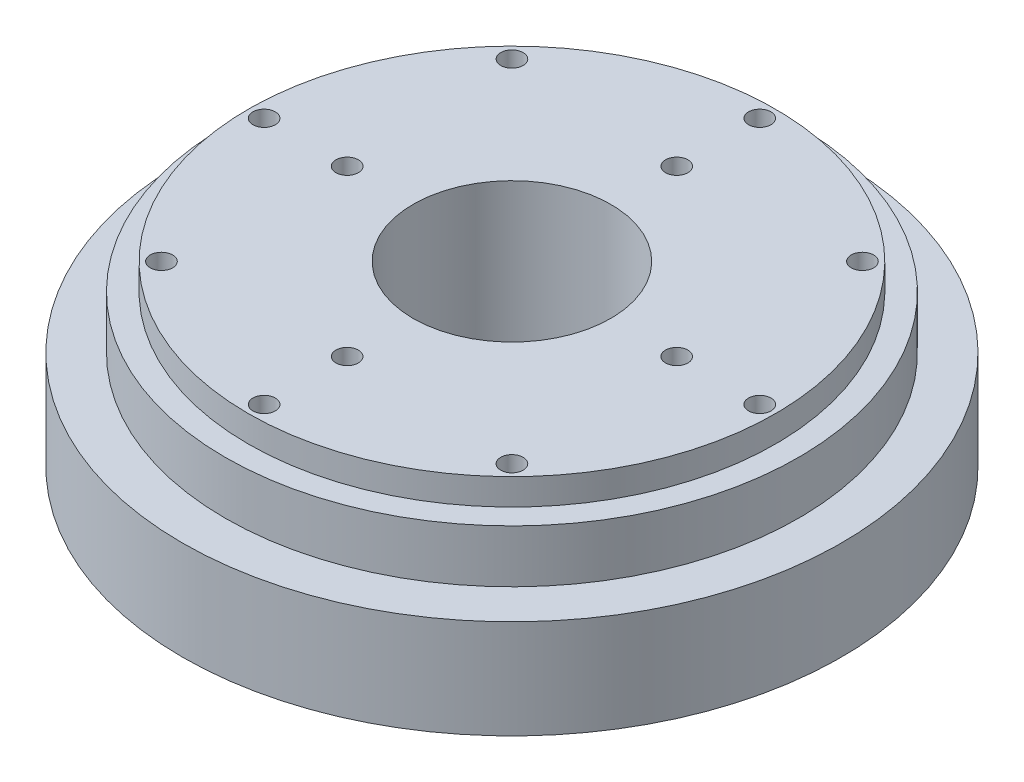
ISO-10303-21;
HEADER;
FILE_DESCRIPTION(('STEP AP214'),'2;1');
FILE_NAME('part.step','',(''),(''),'','','');
FILE_SCHEMA(('AUTOMOTIVE_DESIGN { 1 0 10303 214 1 1 1 1 }'));
ENDSEC;
DATA;
#1=APPLICATION_CONTEXT('core data for automotive mechanical design processes');
#2=APPLICATION_PROTOCOL_DEFINITION('international standard','automotive_design',2000,#1);
#3=PRODUCT_CONTEXT('',#1,'mechanical');
#4=PRODUCT('Part','Part','',(#3));
#5=PRODUCT_RELATED_PRODUCT_CATEGORY('part','',(#4));
#6=PRODUCT_DEFINITION_FORMATION('','',#4);
#7=PRODUCT_DEFINITION_CONTEXT('part definition',#1,'design');
#8=PRODUCT_DEFINITION('design','',#6,#7);
#9=PRODUCT_DEFINITION_SHAPE('','',#8);
#10=(LENGTH_UNIT() NAMED_UNIT(*) SI_UNIT(.MILLI.,.METRE.));
#11=(NAMED_UNIT(*) PLANE_ANGLE_UNIT() SI_UNIT($,.RADIAN.));
#12=(NAMED_UNIT(*) SI_UNIT($,.STERADIAN.) SOLID_ANGLE_UNIT());
#13=UNCERTAINTY_MEASURE_WITH_UNIT(LENGTH_MEASURE(1.E-05),#10,'distance_accuracy_value','');
#14=(GEOMETRIC_REPRESENTATION_CONTEXT(3) GLOBAL_UNCERTAINTY_ASSIGNED_CONTEXT((#13)) GLOBAL_UNIT_ASSIGNED_CONTEXT((#10,
#11,#12)) REPRESENTATION_CONTEXT('',''));
#15=CARTESIAN_POINT('',(0.,0.,0.));
#16=DIRECTION('',(0.,0.,1.));
#17=DIRECTION('',(1.,0.,0.));
#18=AXIS2_PLACEMENT_3D('',#15,#16,#17);
#19=CARTESIAN_POINT('',(0.,15.,0.));
#20=DIRECTION('',(0.,1.,0.));
#21=DIRECTION('',(0.,0.,1.));
#22=AXIS2_PLACEMENT_3D('',#19,#20,#21);
#23=PLANE('',#22);
#24=CARTESIAN_POINT('',(0.,15.,0.));
#25=DIRECTION('',(0.,1.,0.));
#26=DIRECTION('',(0.,0.,1.));
#27=AXIS2_PLACEMENT_3D('',#24,#25,#26);
#28=CIRCLE('',#27,43.5);
#29=CARTESIAN_POINT('',(0.,15.,43.5));
#30=VERTEX_POINT('',#29);
#31=EDGE_CURVE('E42',#30,#30,#28,.T.);
#32=ORIENTED_EDGE('',*,*,#31,.F.);
#33=EDGE_LOOP('',(#32));
#34=FACE_BOUND('',#33,.T.);
#35=CARTESIAN_POINT('',(0.,15.,0.));
#36=DIRECTION('',(0.,1.,0.));
#37=DIRECTION('',(0.,0.,1.));
#38=AXIS2_PLACEMENT_3D('',#35,#36,#37);
#39=CIRCLE('',#38,50.);
#40=CARTESIAN_POINT('',(0.,15.,50.));
#41=VERTEX_POINT('',#40);
#42=EDGE_CURVE('E173',#41,#41,#39,.T.);
#43=ORIENTED_EDGE('',*,*,#42,.T.);
#44=EDGE_LOOP('',(#43));
#45=FACE_BOUND('',#44,.T.);
#46=ADVANCED_FACE('F33',(#34,#45),#23,.T.);
#47=CARTESIAN_POINT('',(0.,0.,0.));
#48=DIRECTION('',(0.,1.,0.));
#49=DIRECTION('',(0.,0.,1.));
#50=AXIS2_PLACEMENT_3D('',#47,#48,#49);
#51=PLANE('',#50);
#52=CARTESIAN_POINT('',(0.,0.,0.));
#53=DIRECTION('',(0.,1.,0.));
#54=DIRECTION('',(0.,0.,1.));
#55=AXIS2_PLACEMENT_3D('',#52,#53,#54);
#56=CIRCLE('',#55,50.);
#57=CARTESIAN_POINT('',(0.,0.,50.));
#58=VERTEX_POINT('',#57);
#59=EDGE_CURVE('E37',#58,#58,#56,.T.);
#60=ORIENTED_EDGE('',*,*,#59,.F.);
#61=EDGE_LOOP('',(#60));
#62=FACE_BOUND('',#61,.T.);
#63=CARTESIAN_POINT('',(0.,0.,0.));
#64=DIRECTION('',(0.,1.,0.));
#65=DIRECTION('',(0.,0.,1.));
#66=AXIS2_PLACEMENT_3D('',#63,#64,#65);
#67=CIRCLE('',#66,15.);
#68=CARTESIAN_POINT('',(0.,0.,15.));
#69=VERTEX_POINT('',#68);
#70=EDGE_CURVE('E170',#69,#69,#67,.T.);
#71=ORIENTED_EDGE('',*,*,#70,.T.);
#72=EDGE_LOOP('',(#71));
#73=FACE_BOUND('',#72,.T.);
#74=ADVANCED_FACE('F182',(#62,#73),#51,.F.);
#75=CARTESIAN_POINT('',(0.,15.,0.));
#76=DIRECTION('',(0.,-1.,0.));
#77=DIRECTION('',(0.,0.,-1.));
#78=AXIS2_PLACEMENT_3D('',#75,#76,#77);
#79=CYLINDRICAL_SURFACE('',#78,50.);
#80=ORIENTED_EDGE('',*,*,#42,.F.);
#81=EDGE_LOOP('',(#80));
#82=FACE_BOUND('',#81,.T.);
#83=ORIENTED_EDGE('',*,*,#59,.T.);
#84=EDGE_LOOP('',(#83));
#85=FACE_BOUND('',#84,.T.);
#86=ADVANCED_FACE('F35',(#82,#85),#79,.T.);
#87=CARTESIAN_POINT('',(0.,15.,0.));
#88=DIRECTION('',(0.,-1.,0.));
#89=DIRECTION('',(0.,0.,-1.));
#90=AXIS2_PLACEMENT_3D('',#87,#88,#89);
#91=CYLINDRICAL_SURFACE('',#90,15.);
#92=ORIENTED_EDGE('',*,*,#70,.F.);
#93=EDGE_LOOP('',(#92));
#94=FACE_BOUND('',#93,.T.);
#95=CARTESIAN_POINT('',(0.,27.,0.));
#96=DIRECTION('',(0.,1.,0.));
#97=DIRECTION('',(0.,0.,1.));
#98=AXIS2_PLACEMENT_3D('',#95,#96,#97);
#99=CIRCLE('',#98,15.);
#100=CARTESIAN_POINT('',(0.,27.,15.));
#101=VERTEX_POINT('',#100);
#102=EDGE_CURVE('E161',#101,#101,#99,.T.);
#103=ORIENTED_EDGE('',*,*,#102,.T.);
#104=EDGE_LOOP('',(#103));
#105=FACE_BOUND('',#104,.T.);
#106=ADVANCED_FACE('F187',(#94,#105),#91,.F.);
#107=CARTESIAN_POINT('',(0.,23.,0.));
#108=DIRECTION('',(0.,1.,0.));
#109=DIRECTION('',(0.,0.,1.));
#110=AXIS2_PLACEMENT_3D('',#107,#108,#109);
#111=PLANE('',#110);
#112=CARTESIAN_POINT('',(0.,23.,0.));
#113=DIRECTION('',(0.,1.,0.));
#114=DIRECTION('',(0.,0.,1.));
#115=AXIS2_PLACEMENT_3D('',#112,#113,#114);
#116=CIRCLE('',#115,40.);
#117=CARTESIAN_POINT('',(0.,23.,40.));
#118=VERTEX_POINT('',#117);
#119=EDGE_CURVE('E11',#118,#118,#116,.T.);
#120=ORIENTED_EDGE('',*,*,#119,.F.);
#121=EDGE_LOOP('',(#120));
#122=FACE_BOUND('',#121,.T.);
#123=CARTESIAN_POINT('',(0.,23.,0.));
#124=DIRECTION('',(0.,1.,0.));
#125=DIRECTION('',(0.,0.,1.));
#126=AXIS2_PLACEMENT_3D('',#123,#124,#125);
#127=CIRCLE('',#126,43.5);
#128=CARTESIAN_POINT('',(0.,23.,43.5));
#129=VERTEX_POINT('',#128);
#130=EDGE_CURVE('E166',#129,#129,#127,.T.);
#131=ORIENTED_EDGE('',*,*,#130,.T.);
#132=EDGE_LOOP('',(#131));
#133=FACE_BOUND('',#132,.T.);
#134=ADVANCED_FACE('F190',(#122,#133),#111,.T.);
#135=CARTESIAN_POINT('',(0.,23.,0.));
#136=DIRECTION('',(0.,-1.,0.));
#137=DIRECTION('',(0.,0.,-1.));
#138=AXIS2_PLACEMENT_3D('',#135,#136,#137);
#139=CYLINDRICAL_SURFACE('',#138,43.5);
#140=ORIENTED_EDGE('',*,*,#130,.F.);
#141=EDGE_LOOP('',(#140));
#142=FACE_BOUND('',#141,.T.);
#143=ORIENTED_EDGE('',*,*,#31,.T.);
#144=EDGE_LOOP('',(#143));
#145=FACE_BOUND('',#144,.T.);
#146=ADVANCED_FACE('F197',(#142,#145),#139,.T.);
#147=CARTESIAN_POINT('',(0.,27.,0.));
#148=DIRECTION('',(0.,1.,0.));
#149=DIRECTION('',(0.,0.,1.));
#150=AXIS2_PLACEMENT_3D('',#147,#148,#149);
#151=PLANE('',#150);
#152=CARTESIAN_POINT('',(0.,27.,-25.));
#153=DIRECTION('',(0.,1.,0.));
#154=DIRECTION('',(0.,0.,1.));
#155=AXIS2_PLACEMENT_3D('',#152,#153,#154);
#156=CIRCLE('',#155,1.69999999999999);
#157=CARTESIAN_POINT('',(0.,27.,-23.3));
#158=VERTEX_POINT('',#157);
#159=EDGE_CURVE('E91',#158,#158,#156,.T.);
#160=ORIENTED_EDGE('',*,*,#159,.F.);
#161=EDGE_LOOP('',(#160));
#162=FACE_BOUND('',#161,.T.);
#163=CARTESIAN_POINT('',(25.0000000000007,27.,-7.05950310263298E-13));
#164=DIRECTION('',(0.,1.,0.));
#165=DIRECTION('',(0.,0.,1.));
#166=AXIS2_PLACEMENT_3D('',#163,#164,#165);
#167=CIRCLE('',#166,1.69999999999999);
#168=CARTESIAN_POINT('',(25.0000000000007,27.,1.69999999999928));
#169=VERTEX_POINT('',#168);
#170=EDGE_CURVE('E90',#169,#169,#167,.T.);
#171=ORIENTED_EDGE('',*,*,#170,.F.);
#172=EDGE_LOOP('',(#171));
#173=FACE_BOUND('',#172,.T.);
#174=CARTESIAN_POINT('',(1.4119006205266E-12,27.,25.));
#175=DIRECTION('',(0.,1.,0.));
#176=DIRECTION('',(0.,0.,1.));
#177=AXIS2_PLACEMENT_3D('',#174,#175,#176);
#178=CIRCLE('',#177,1.69999999999999);
#179=CARTESIAN_POINT('',(1.4119006205266E-12,27.,26.7));
#180=VERTEX_POINT('',#179);
#181=EDGE_CURVE('E101',#180,#180,#178,.T.);
#182=ORIENTED_EDGE('',*,*,#181,.F.);
#183=EDGE_LOOP('',(#182));
#184=FACE_BOUND('',#183,.T.);
#185=CARTESIAN_POINT('',(-24.9999999999993,27.,7.02888693265429E-13));
#186=DIRECTION('',(0.,1.,0.));
#187=DIRECTION('',(0.,0.,1.));
#188=AXIS2_PLACEMENT_3D('',#185,#186,#187);
#189=CIRCLE('',#188,1.69999999999999);
#190=CARTESIAN_POINT('',(-24.9999999999993,27.,1.70000000000069));
#191=VERTEX_POINT('',#190);
#192=EDGE_CURVE('E107',#191,#191,#189,.T.);
#193=ORIENTED_EDGE('',*,*,#192,.F.);
#194=EDGE_LOOP('',(#193));
#195=FACE_BOUND('',#194,.T.);
#196=CARTESIAN_POINT('',(0.,27.,-37.6));
#197=DIRECTION('',(0.,1.,0.));
#198=DIRECTION('',(0.,0.,1.));
#199=AXIS2_PLACEMENT_3D('',#196,#197,#198);
#200=CIRCLE('',#199,1.69999999999999);
#201=CARTESIAN_POINT('',(0.,27.,-35.9));
#202=VERTEX_POINT('',#201);
#203=EDGE_CURVE('E113',#202,#202,#200,.T.);
#204=ORIENTED_EDGE('',*,*,#203,.F.);
#205=EDGE_LOOP('',(#204));
#206=FACE_BOUND('',#205,.T.);
#207=CARTESIAN_POINT('',(26.5872149726142,27.,-26.5872149726142));
#208=DIRECTION('',(0.,1.,0.));
#209=DIRECTION('',(0.,0.,1.));
#210=AXIS2_PLACEMENT_3D('',#207,#208,#209);
#211=CIRCLE('',#210,1.69999999999999);
#212=CARTESIAN_POINT('',(26.5872149726142,27.,-24.8872149726142));
#213=VERTEX_POINT('',#212);
#214=EDGE_CURVE('E119',#213,#213,#211,.T.);
#215=ORIENTED_EDGE('',*,*,#214,.F.);
#216=EDGE_LOOP('',(#215));
#217=FACE_BOUND('',#216,.T.);
#218=CARTESIAN_POINT('',(37.6,27.,0.));
#219=DIRECTION('',(0.,1.,0.));
#220=DIRECTION('',(0.,0.,1.));
#221=AXIS2_PLACEMENT_3D('',#218,#219,#220);
#222=CIRCLE('',#221,1.69999999999999);
#223=CARTESIAN_POINT('',(37.6,27.,1.69999999999999));
#224=VERTEX_POINT('',#223);
#225=EDGE_CURVE('E125',#224,#224,#222,.T.);
#226=ORIENTED_EDGE('',*,*,#225,.F.);
#227=EDGE_LOOP('',(#226));
#228=FACE_BOUND('',#227,.T.);
#229=CARTESIAN_POINT('',(26.5872149726142,27.,26.5872149726142));
#230=DIRECTION('',(0.,1.,0.));
#231=DIRECTION('',(0.,0.,1.));
#232=AXIS2_PLACEMENT_3D('',#229,#230,#231);
#233=CIRCLE('',#232,1.69999999999999);
#234=CARTESIAN_POINT('',(26.5872149726142,27.,28.2872149726142));
#235=VERTEX_POINT('',#234);
#236=EDGE_CURVE('E131',#235,#235,#233,.T.);
#237=ORIENTED_EDGE('',*,*,#236,.F.);
#238=EDGE_LOOP('',(#237));
#239=FACE_BOUND('',#238,.T.);
#240=CARTESIAN_POINT('',(0.,27.,37.6));
#241=DIRECTION('',(0.,1.,0.));
#242=DIRECTION('',(0.,0.,1.));
#243=AXIS2_PLACEMENT_3D('',#240,#241,#242);
#244=CIRCLE('',#243,1.69999999999999);
#245=CARTESIAN_POINT('',(0.,27.,39.3));
#246=VERTEX_POINT('',#245);
#247=EDGE_CURVE('E137',#246,#246,#244,.T.);
#248=ORIENTED_EDGE('',*,*,#247,.F.);
#249=EDGE_LOOP('',(#248));
#250=FACE_BOUND('',#249,.T.);
#251=CARTESIAN_POINT('',(-26.5872149726142,27.,26.5872149726142));
#252=DIRECTION('',(0.,1.,0.));
#253=DIRECTION('',(0.,0.,1.));
#254=AXIS2_PLACEMENT_3D('',#251,#252,#253);
#255=CIRCLE('',#254,1.69999999999999);
#256=CARTESIAN_POINT('',(-26.5872149726142,27.,28.2872149726142));
#257=VERTEX_POINT('',#256);
#258=EDGE_CURVE('E143',#257,#257,#255,.T.);
#259=ORIENTED_EDGE('',*,*,#258,.F.);
#260=EDGE_LOOP('',(#259));
#261=FACE_BOUND('',#260,.T.);
#262=CARTESIAN_POINT('',(-37.6,27.,0.));
#263=DIRECTION('',(0.,1.,0.));
#264=DIRECTION('',(0.,0.,1.));
#265=AXIS2_PLACEMENT_3D('',#262,#263,#264);
#266=CIRCLE('',#265,1.69999999999999);
#267=CARTESIAN_POINT('',(-37.6,27.,1.7));
#268=VERTEX_POINT('',#267);
#269=EDGE_CURVE('E149',#268,#268,#266,.T.);
#270=ORIENTED_EDGE('',*,*,#269,.F.);
#271=EDGE_LOOP('',(#270));
#272=FACE_BOUND('',#271,.T.);
#273=CARTESIAN_POINT('',(-26.5872149726142,27.,-26.5872149726142));
#274=DIRECTION('',(0.,1.,0.));
#275=DIRECTION('',(0.,0.,1.));
#276=AXIS2_PLACEMENT_3D('',#273,#274,#275);
#277=CIRCLE('',#276,1.69999999999999);
#278=CARTESIAN_POINT('',(-26.5872149726142,27.,-24.8872149726142));
#279=VERTEX_POINT('',#278);
#280=EDGE_CURVE('E155',#279,#279,#277,.T.);
#281=ORIENTED_EDGE('',*,*,#280,.F.);
#282=EDGE_LOOP('',(#281));
#283=FACE_BOUND('',#282,.T.);
#284=CARTESIAN_POINT('',(0.,27.,0.));
#285=DIRECTION('',(0.,1.,0.));
#286=DIRECTION('',(0.,0.,1.));
#287=AXIS2_PLACEMENT_3D('',#284,#285,#286);
#288=CIRCLE('',#287,40.);
#289=CARTESIAN_POINT('',(0.,27.,40.));
#290=VERTEX_POINT('',#289);
#291=EDGE_CURVE('E164',#290,#290,#288,.T.);
#292=ORIENTED_EDGE('',*,*,#291,.T.);
#293=EDGE_LOOP('',(#292));
#294=FACE_BOUND('',#293,.T.);
#295=ORIENTED_EDGE('',*,*,#102,.F.);
#296=EDGE_LOOP('',(#295));
#297=FACE_BOUND('',#296,.T.);
#298=ADVANCED_FACE('F194',(#162,#173,#184,#195,#206,#217,#228,#239,#250,#261,#272,#283,#294,
#297),#151,.T.);
#299=CARTESIAN_POINT('',(0.,27.,0.));
#300=DIRECTION('',(0.,-1.,0.));
#301=DIRECTION('',(0.,0.,-1.));
#302=AXIS2_PLACEMENT_3D('',#299,#300,#301);
#303=CYLINDRICAL_SURFACE('',#302,40.);
#304=ORIENTED_EDGE('',*,*,#291,.F.);
#305=EDGE_LOOP('',(#304));
#306=FACE_BOUND('',#305,.T.);
#307=ORIENTED_EDGE('',*,*,#119,.T.);
#308=EDGE_LOOP('',(#307));
#309=FACE_BOUND('',#308,.T.);
#310=ADVANCED_FACE('F196',(#306,#309),#303,.T.);
#311=CARTESIAN_POINT('',(-26.5872149726142,17.,-26.5872149726142));
#312=DIRECTION('',(0.,1.,0.));
#313=DIRECTION('',(0.,0.,1.));
#314=AXIS2_PLACEMENT_3D('',#311,#312,#313);
#315=CONICAL_SURFACE('',#314,1.7,1.02974425867665);
#316=CARTESIAN_POINT('',(-26.5872149726142,15.9785369476531,-26.5872149726142));
#317=VERTEX_POINT('',#316);
#318=VERTEX_LOOP('',#317);
#319=FACE_BOUND('',#318,.T.);
#320=CARTESIAN_POINT('',(-26.5872149726142,17.,-26.5872149726142));
#321=DIRECTION('',(0.,1.,0.));
#322=DIRECTION('',(0.,0.,1.));
#323=AXIS2_PLACEMENT_3D('',#320,#321,#322);
#324=CIRCLE('',#323,1.7);
#325=CARTESIAN_POINT('',(-26.5872149726142,17.,-24.8872149726142));
#326=VERTEX_POINT('',#325);
#327=EDGE_CURVE('E158',#326,#326,#324,.T.);
#328=ORIENTED_EDGE('',*,*,#327,.T.);
#329=EDGE_LOOP('',(#328));
#330=FACE_BOUND('',#329,.T.);
#331=ADVANCED_FACE('F204',(#319,#330),#315,.F.);
#332=CARTESIAN_POINT('',(-26.5872149726142,27.,-26.5872149726142));
#333=DIRECTION('',(0.,1.,0.));
#334=DIRECTION('',(0.,0.,1.));
#335=AXIS2_PLACEMENT_3D('',#332,#333,#334);
#336=CYLINDRICAL_SURFACE('',#335,1.69999999999999);
#337=ORIENTED_EDGE('',*,*,#327,.F.);
#338=EDGE_LOOP('',(#337));
#339=FACE_BOUND('',#338,.T.);
#340=ORIENTED_EDGE('',*,*,#280,.T.);
#341=EDGE_LOOP('',(#340));
#342=FACE_BOUND('',#341,.T.);
#343=ADVANCED_FACE('F267',(#339,#342),#336,.F.);
#344=CARTESIAN_POINT('',(-37.6,17.,0.));
#345=DIRECTION('',(0.,1.,0.));
#346=DIRECTION('',(0.,0.,1.));
#347=AXIS2_PLACEMENT_3D('',#344,#345,#346);
#348=CONICAL_SURFACE('',#347,1.69999999999999,1.02974425867665);
#349=CARTESIAN_POINT('',(-37.6,15.9785369476531,0.));
#350=VERTEX_POINT('',#349);
#351=VERTEX_LOOP('',#350);
#352=FACE_BOUND('',#351,.T.);
#353=CARTESIAN_POINT('',(-37.6,17.,0.));
#354=DIRECTION('',(0.,1.,0.));
#355=DIRECTION('',(0.,0.,1.));
#356=AXIS2_PLACEMENT_3D('',#353,#354,#355);
#357=CIRCLE('',#356,1.69999999999999);
#358=CARTESIAN_POINT('',(-37.6,17.,1.7));
#359=VERTEX_POINT('',#358);
#360=EDGE_CURVE('E152',#359,#359,#357,.T.);
#361=ORIENTED_EDGE('',*,*,#360,.T.);
#362=EDGE_LOOP('',(#361));
#363=FACE_BOUND('',#362,.T.);
#364=ADVANCED_FACE('F274',(#352,#363),#348,.F.);
#365=CARTESIAN_POINT('',(-37.6,27.,0.));
#366=DIRECTION('',(0.,1.,0.));
#367=DIRECTION('',(0.,0.,1.));
#368=AXIS2_PLACEMENT_3D('',#365,#366,#367);
#369=CYLINDRICAL_SURFACE('',#368,1.69999999999999);
#370=ORIENTED_EDGE('',*,*,#360,.F.);
#371=EDGE_LOOP('',(#370));
#372=FACE_BOUND('',#371,.T.);
#373=ORIENTED_EDGE('',*,*,#269,.T.);
#374=EDGE_LOOP('',(#373));
#375=FACE_BOUND('',#374,.T.);
#376=ADVANCED_FACE('F283',(#372,#375),#369,.F.);
#377=CARTESIAN_POINT('',(-26.5872149726142,17.,26.5872149726142));
#378=DIRECTION('',(0.,1.,0.));
#379=DIRECTION('',(0.,0.,1.));
#380=AXIS2_PLACEMENT_3D('',#377,#378,#379);
#381=CONICAL_SURFACE('',#380,1.7,1.02974425867665);
#382=CARTESIAN_POINT('',(-26.5872149726142,15.9785369476531,26.5872149726142));
#383=VERTEX_POINT('',#382);
#384=VERTEX_LOOP('',#383);
#385=FACE_BOUND('',#384,.T.);
#386=CARTESIAN_POINT('',(-26.5872149726142,17.,26.5872149726142));
#387=DIRECTION('',(0.,1.,0.));
#388=DIRECTION('',(0.,0.,1.));
#389=AXIS2_PLACEMENT_3D('',#386,#387,#388);
#390=CIRCLE('',#389,1.7);
#391=CARTESIAN_POINT('',(-26.5872149726142,17.,28.2872149726142));
#392=VERTEX_POINT('',#391);
#393=EDGE_CURVE('E146',#392,#392,#390,.T.);
#394=ORIENTED_EDGE('',*,*,#393,.T.);
#395=EDGE_LOOP('',(#394));
#396=FACE_BOUND('',#395,.T.);
#397=ADVANCED_FACE('F291',(#385,#396),#381,.F.);
#398=CARTESIAN_POINT('',(-26.5872149726142,27.,26.5872149726142));
#399=DIRECTION('',(0.,1.,0.));
#400=DIRECTION('',(0.,0.,1.));
#401=AXIS2_PLACEMENT_3D('',#398,#399,#400);
#402=CYLINDRICAL_SURFACE('',#401,1.69999999999999);
#403=ORIENTED_EDGE('',*,*,#393,.F.);
#404=EDGE_LOOP('',(#403));
#405=FACE_BOUND('',#404,.T.);
#406=ORIENTED_EDGE('',*,*,#258,.T.);
#407=EDGE_LOOP('',(#406));
#408=FACE_BOUND('',#407,.T.);
#409=ADVANCED_FACE('F300',(#405,#408),#402,.F.);
#410=CARTESIAN_POINT('',(0.,17.,37.6));
#411=DIRECTION('',(0.,1.,0.));
#412=DIRECTION('',(0.,0.,1.));
#413=AXIS2_PLACEMENT_3D('',#410,#411,#412);
#414=CONICAL_SURFACE('',#413,1.7,1.02974425867665);
#415=CARTESIAN_POINT('',(0.,15.9785369476531,37.6));
#416=VERTEX_POINT('',#415);
#417=VERTEX_LOOP('',#416);
#418=FACE_BOUND('',#417,.T.);
#419=CARTESIAN_POINT('',(0.,17.,37.6));
#420=DIRECTION('',(0.,1.,0.));
#421=DIRECTION('',(0.,0.,1.));
#422=AXIS2_PLACEMENT_3D('',#419,#420,#421);
#423=CIRCLE('',#422,1.7);
#424=CARTESIAN_POINT('',(0.,17.,39.3));
#425=VERTEX_POINT('',#424);
#426=EDGE_CURVE('E140',#425,#425,#423,.T.);
#427=ORIENTED_EDGE('',*,*,#426,.T.);
#428=EDGE_LOOP('',(#427));
#429=FACE_BOUND('',#428,.T.);
#430=ADVANCED_FACE('F309',(#418,#429),#414,.F.);
#431=CARTESIAN_POINT('',(0.,27.,37.6));
#432=DIRECTION('',(0.,1.,0.));
#433=DIRECTION('',(0.,0.,1.));
#434=AXIS2_PLACEMENT_3D('',#431,#432,#433);
#435=CYLINDRICAL_SURFACE('',#434,1.69999999999999);
#436=ORIENTED_EDGE('',*,*,#426,.F.);
#437=EDGE_LOOP('',(#436));
#438=FACE_BOUND('',#437,.T.);
#439=ORIENTED_EDGE('',*,*,#247,.T.);
#440=EDGE_LOOP('',(#439));
#441=FACE_BOUND('',#440,.T.);
#442=ADVANCED_FACE('F318',(#438,#441),#435,.F.);
#443=CARTESIAN_POINT('',(26.5872149726142,17.,26.5872149726142));
#444=DIRECTION('',(0.,1.,0.));
#445=DIRECTION('',(0.,0.,1.));
#446=AXIS2_PLACEMENT_3D('',#443,#444,#445);
#447=CONICAL_SURFACE('',#446,1.7,1.02974425867665);
#448=CARTESIAN_POINT('',(26.5872149726142,15.9785369476531,26.5872149726142));
#449=VERTEX_POINT('',#448);
#450=VERTEX_LOOP('',#449);
#451=FACE_BOUND('',#450,.T.);
#452=CARTESIAN_POINT('',(26.5872149726142,17.,26.5872149726142));
#453=DIRECTION('',(0.,1.,0.));
#454=DIRECTION('',(0.,0.,1.));
#455=AXIS2_PLACEMENT_3D('',#452,#453,#454);
#456=CIRCLE('',#455,1.7);
#457=CARTESIAN_POINT('',(26.5872149726142,17.,28.2872149726142));
#458=VERTEX_POINT('',#457);
#459=EDGE_CURVE('E134',#458,#458,#456,.T.);
#460=ORIENTED_EDGE('',*,*,#459,.T.);
#461=EDGE_LOOP('',(#460));
#462=FACE_BOUND('',#461,.T.);
#463=ADVANCED_FACE('F327',(#451,#462),#447,.F.);
#464=CARTESIAN_POINT('',(26.5872149726142,27.,26.5872149726142));
#465=DIRECTION('',(0.,1.,0.));
#466=DIRECTION('',(0.,0.,1.));
#467=AXIS2_PLACEMENT_3D('',#464,#465,#466);
#468=CYLINDRICAL_SURFACE('',#467,1.69999999999999);
#469=ORIENTED_EDGE('',*,*,#459,.F.);
#470=EDGE_LOOP('',(#469));
#471=FACE_BOUND('',#470,.T.);
#472=ORIENTED_EDGE('',*,*,#236,.T.);
#473=EDGE_LOOP('',(#472));
#474=FACE_BOUND('',#473,.T.);
#475=ADVANCED_FACE('F336',(#471,#474),#468,.F.);
#476=CARTESIAN_POINT('',(37.6,17.,0.));
#477=DIRECTION('',(0.,1.,0.));
#478=DIRECTION('',(0.,0.,1.));
#479=AXIS2_PLACEMENT_3D('',#476,#477,#478);
#480=CONICAL_SURFACE('',#479,1.69999999999999,1.02974425867665);
#481=CARTESIAN_POINT('',(37.6,15.9785369476531,0.));
#482=VERTEX_POINT('',#481);
#483=VERTEX_LOOP('',#482);
#484=FACE_BOUND('',#483,.T.);
#485=CARTESIAN_POINT('',(37.6,17.,0.));
#486=DIRECTION('',(0.,1.,0.));
#487=DIRECTION('',(0.,0.,1.));
#488=AXIS2_PLACEMENT_3D('',#485,#486,#487);
#489=CIRCLE('',#488,1.69999999999999);
#490=CARTESIAN_POINT('',(37.6,17.,1.69999999999999));
#491=VERTEX_POINT('',#490);
#492=EDGE_CURVE('E128',#491,#491,#489,.T.);
#493=ORIENTED_EDGE('',*,*,#492,.T.);
#494=EDGE_LOOP('',(#493));
#495=FACE_BOUND('',#494,.T.);
#496=ADVANCED_FACE('F345',(#484,#495),#480,.F.);
#497=CARTESIAN_POINT('',(37.6,27.,0.));
#498=DIRECTION('',(0.,1.,0.));
#499=DIRECTION('',(0.,0.,1.));
#500=AXIS2_PLACEMENT_3D('',#497,#498,#499);
#501=CYLINDRICAL_SURFACE('',#500,1.69999999999999);
#502=ORIENTED_EDGE('',*,*,#492,.F.);
#503=EDGE_LOOP('',(#502));
#504=FACE_BOUND('',#503,.T.);
#505=ORIENTED_EDGE('',*,*,#225,.T.);
#506=EDGE_LOOP('',(#505));
#507=FACE_BOUND('',#506,.T.);
#508=ADVANCED_FACE('F354',(#504,#507),#501,.F.);
#509=CARTESIAN_POINT('',(26.5872149726142,17.,-26.5872149726142));
#510=DIRECTION('',(0.,1.,0.));
#511=DIRECTION('',(0.,0.,1.));
#512=AXIS2_PLACEMENT_3D('',#509,#510,#511);
#513=CONICAL_SURFACE('',#512,1.7,1.02974425867665);
#514=CARTESIAN_POINT('',(26.5872149726142,15.9785369476531,-26.5872149726142));
#515=VERTEX_POINT('',#514);
#516=VERTEX_LOOP('',#515);
#517=FACE_BOUND('',#516,.T.);
#518=CARTESIAN_POINT('',(26.5872149726142,17.,-26.5872149726142));
#519=DIRECTION('',(0.,1.,0.));
#520=DIRECTION('',(0.,0.,1.));
#521=AXIS2_PLACEMENT_3D('',#518,#519,#520);
#522=CIRCLE('',#521,1.7);
#523=CARTESIAN_POINT('',(26.5872149726142,17.,-24.8872149726142));
#524=VERTEX_POINT('',#523);
#525=EDGE_CURVE('E122',#524,#524,#522,.T.);
#526=ORIENTED_EDGE('',*,*,#525,.T.);
#527=EDGE_LOOP('',(#526));
#528=FACE_BOUND('',#527,.T.);
#529=ADVANCED_FACE('F363',(#517,#528),#513,.F.);
#530=CARTESIAN_POINT('',(26.5872149726142,27.,-26.5872149726142));
#531=DIRECTION('',(0.,1.,0.));
#532=DIRECTION('',(0.,0.,1.));
#533=AXIS2_PLACEMENT_3D('',#530,#531,#532);
#534=CYLINDRICAL_SURFACE('',#533,1.69999999999999);
#535=ORIENTED_EDGE('',*,*,#525,.F.);
#536=EDGE_LOOP('',(#535));
#537=FACE_BOUND('',#536,.T.);
#538=ORIENTED_EDGE('',*,*,#214,.T.);
#539=EDGE_LOOP('',(#538));
#540=FACE_BOUND('',#539,.T.);
#541=ADVANCED_FACE('F372',(#537,#540),#534,.F.);
#542=CARTESIAN_POINT('',(0.,17.,-37.6));
#543=DIRECTION('',(0.,1.,0.));
#544=DIRECTION('',(0.,0.,1.));
#545=AXIS2_PLACEMENT_3D('',#542,#543,#544);
#546=CONICAL_SURFACE('',#545,1.7,1.02974425867665);
#547=CARTESIAN_POINT('',(0.,15.9785369476531,-37.6));
#548=VERTEX_POINT('',#547);
#549=VERTEX_LOOP('',#548);
#550=FACE_BOUND('',#549,.T.);
#551=CARTESIAN_POINT('',(0.,17.,-37.6));
#552=DIRECTION('',(0.,1.,0.));
#553=DIRECTION('',(0.,0.,1.));
#554=AXIS2_PLACEMENT_3D('',#551,#552,#553);
#555=CIRCLE('',#554,1.7);
#556=CARTESIAN_POINT('',(0.,17.,-35.9));
#557=VERTEX_POINT('',#556);
#558=EDGE_CURVE('E116',#557,#557,#555,.T.);
#559=ORIENTED_EDGE('',*,*,#558,.T.);
#560=EDGE_LOOP('',(#559));
#561=FACE_BOUND('',#560,.T.);
#562=ADVANCED_FACE('F381',(#550,#561),#546,.F.);
#563=CARTESIAN_POINT('',(0.,27.,-37.6));
#564=DIRECTION('',(0.,1.,0.));
#565=DIRECTION('',(0.,0.,1.));
#566=AXIS2_PLACEMENT_3D('',#563,#564,#565);
#567=CYLINDRICAL_SURFACE('',#566,1.69999999999999);
#568=ORIENTED_EDGE('',*,*,#558,.F.);
#569=EDGE_LOOP('',(#568));
#570=FACE_BOUND('',#569,.T.);
#571=ORIENTED_EDGE('',*,*,#203,.T.);
#572=EDGE_LOOP('',(#571));
#573=FACE_BOUND('',#572,.T.);
#574=ADVANCED_FACE('F390',(#570,#573),#567,.F.);
#575=CARTESIAN_POINT('',(-24.9999999999993,7.,7.02888693265429E-13));
#576=DIRECTION('',(0.,1.,0.));
#577=DIRECTION('',(0.,0.,1.));
#578=AXIS2_PLACEMENT_3D('',#575,#576,#577);
#579=CONICAL_SURFACE('',#578,1.69999999999999,1.02974425867665);
#580=CARTESIAN_POINT('',(-24.9999999999993,5.97853694765315,7.02888693265429E-13));
#581=VERTEX_POINT('',#580);
#582=VERTEX_LOOP('',#581);
#583=FACE_BOUND('',#582,.T.);
#584=CARTESIAN_POINT('',(-24.9999999999993,7.,7.02888693265429E-13));
#585=DIRECTION('',(0.,1.,0.));
#586=DIRECTION('',(0.,0.,1.));
#587=AXIS2_PLACEMENT_3D('',#584,#585,#586);
#588=CIRCLE('',#587,1.69999999999999);
#589=CARTESIAN_POINT('',(-24.9999999999993,7.,1.70000000000069));
#590=VERTEX_POINT('',#589);
#591=EDGE_CURVE('E110',#590,#590,#588,.T.);
#592=ORIENTED_EDGE('',*,*,#591,.T.);
#593=EDGE_LOOP('',(#592));
#594=FACE_BOUND('',#593,.T.);
#595=ADVANCED_FACE('F398',(#583,#594),#579,.F.);
#596=CARTESIAN_POINT('',(-24.9999999999993,27.,7.02888693265429E-13));
#597=DIRECTION('',(0.,1.,0.));
#598=DIRECTION('',(0.,0.,1.));
#599=AXIS2_PLACEMENT_3D('',#596,#597,#598);
#600=CYLINDRICAL_SURFACE('',#599,1.69999999999999);
#601=ORIENTED_EDGE('',*,*,#591,.F.);
#602=EDGE_LOOP('',(#601));
#603=FACE_BOUND('',#602,.T.);
#604=ORIENTED_EDGE('',*,*,#192,.T.);
#605=EDGE_LOOP('',(#604));
#606=FACE_BOUND('',#605,.T.);
#607=ADVANCED_FACE('F406',(#603,#606),#600,.F.);
#608=CARTESIAN_POINT('',(1.4119006205266E-12,7.,25.));
#609=DIRECTION('',(0.,1.,0.));
#610=DIRECTION('',(0.,0.,1.));
#611=AXIS2_PLACEMENT_3D('',#608,#609,#610);
#612=CONICAL_SURFACE('',#611,1.69999999999999,1.02974425867665);
#613=CARTESIAN_POINT('',(1.40703603705956E-12,5.97853694765315,25.));
#614=VERTEX_POINT('',#613);
#615=VERTEX_LOOP('',#614);
#616=FACE_BOUND('',#615,.T.);
#617=CARTESIAN_POINT('',(1.4119006205266E-12,7.,25.));
#618=DIRECTION('',(0.,1.,0.));
#619=DIRECTION('',(0.,0.,1.));
#620=AXIS2_PLACEMENT_3D('',#617,#618,#619);
#621=CIRCLE('',#620,1.69999999999999);
#622=CARTESIAN_POINT('',(1.4119006205266E-12,7.,26.7));
#623=VERTEX_POINT('',#622);
#624=EDGE_CURVE('E104',#623,#623,#621,.T.);
#625=ORIENTED_EDGE('',*,*,#624,.T.);
#626=EDGE_LOOP('',(#625));
#627=FACE_BOUND('',#626,.T.);
#628=ADVANCED_FACE('F415',(#616,#627),#612,.F.);
#629=CARTESIAN_POINT('',(1.4119006205266E-12,27.,25.));
#630=DIRECTION('',(0.,1.,0.));
#631=DIRECTION('',(0.,0.,1.));
#632=AXIS2_PLACEMENT_3D('',#629,#630,#631);
#633=CYLINDRICAL_SURFACE('',#632,1.69999999999999);
#634=ORIENTED_EDGE('',*,*,#624,.F.);
#635=EDGE_LOOP('',(#634));
#636=FACE_BOUND('',#635,.T.);
#637=ORIENTED_EDGE('',*,*,#181,.T.);
#638=EDGE_LOOP('',(#637));
#639=FACE_BOUND('',#638,.T.);
#640=ADVANCED_FACE('F424',(#636,#639),#633,.F.);
#641=CARTESIAN_POINT('',(25.0000000000007,7.,-7.05950310263298E-13));
#642=DIRECTION('',(0.,1.,0.));
#643=DIRECTION('',(0.,0.,1.));
#644=AXIS2_PLACEMENT_3D('',#641,#642,#643);
#645=CONICAL_SURFACE('',#644,1.69999999999999,1.02974425867665);
#646=CARTESIAN_POINT('',(25.0000000000007,5.97853694765315,-7.05950310263298E-13));
#647=VERTEX_POINT('',#646);
#648=VERTEX_LOOP('',#647);
#649=FACE_BOUND('',#648,.T.);
#650=CARTESIAN_POINT('',(25.0000000000007,7.,-7.05950310263298E-13));
#651=DIRECTION('',(0.,1.,0.));
#652=DIRECTION('',(0.,0.,1.));
#653=AXIS2_PLACEMENT_3D('',#650,#651,#652);
#654=CIRCLE('',#653,1.69999999999999);
#655=CARTESIAN_POINT('',(25.0000000000007,7.,1.69999999999928));
#656=VERTEX_POINT('',#655);
#657=EDGE_CURVE('E94',#656,#656,#654,.T.);
#658=ORIENTED_EDGE('',*,*,#657,.T.);
#659=EDGE_LOOP('',(#658));
#660=FACE_BOUND('',#659,.T.);
#661=ADVANCED_FACE('F433',(#649,#660),#645,.F.);
#662=CARTESIAN_POINT('',(25.0000000000007,27.,-7.05950310263298E-13));
#663=DIRECTION('',(0.,1.,0.));
#664=DIRECTION('',(0.,0.,1.));
#665=AXIS2_PLACEMENT_3D('',#662,#663,#664);
#666=CYLINDRICAL_SURFACE('',#665,1.69999999999999);
#667=ORIENTED_EDGE('',*,*,#657,.F.);
#668=EDGE_LOOP('',(#667));
#669=FACE_BOUND('',#668,.T.);
#670=ORIENTED_EDGE('',*,*,#170,.T.);
#671=EDGE_LOOP('',(#670));
#672=FACE_BOUND('',#671,.T.);
#673=ADVANCED_FACE('F84',(#669,#672),#666,.F.);
#674=CARTESIAN_POINT('',(0.,7.,-25.));
#675=DIRECTION('',(0.,1.,0.));
#676=DIRECTION('',(0.,0.,1.));
#677=AXIS2_PLACEMENT_3D('',#674,#675,#676);
#678=CONICAL_SURFACE('',#677,1.69999999999999,1.02974425867665);
#679=CARTESIAN_POINT('',(0.,5.97853694765315,-25.));
#680=VERTEX_POINT('',#679);
#681=VERTEX_LOOP('',#680);
#682=FACE_BOUND('',#681,.T.);
#683=CARTESIAN_POINT('',(0.,7.,-25.));
#684=DIRECTION('',(0.,1.,0.));
#685=DIRECTION('',(0.,0.,1.));
#686=AXIS2_PLACEMENT_3D('',#683,#684,#685);
#687=CIRCLE('',#686,1.69999999999999);
#688=CARTESIAN_POINT('',(0.,7.,-23.3));
#689=VERTEX_POINT('',#688);
#690=EDGE_CURVE('E88',#689,#689,#687,.T.);
#691=ORIENTED_EDGE('',*,*,#690,.T.);
#692=EDGE_LOOP('',(#691));
#693=FACE_BOUND('',#692,.T.);
#694=ADVANCED_FACE('F80',(#682,#693),#678,.F.);
#695=CARTESIAN_POINT('',(0.,27.,-25.));
#696=DIRECTION('',(0.,1.,0.));
#697=DIRECTION('',(0.,0.,1.));
#698=AXIS2_PLACEMENT_3D('',#695,#696,#697);
#699=CYLINDRICAL_SURFACE('',#698,1.69999999999999);
#700=ORIENTED_EDGE('',*,*,#690,.F.);
#701=EDGE_LOOP('',(#700));
#702=FACE_BOUND('',#701,.T.);
#703=ORIENTED_EDGE('',*,*,#159,.T.);
#704=EDGE_LOOP('',(#703));
#705=FACE_BOUND('',#704,.T.);
#706=ADVANCED_FACE('F83',(#702,#705),#699,.F.);
#707=CLOSED_SHELL('',(#46,#74,#86,#106,#134,#146,#298,#310,#331,#343,#364,#376,#397,#409,#430,
#442,#463,#475,#496,#508,#529,#541,#562,#574,#595,#607,#628,#640,#661,#673,#694,#706));
#708=MANIFOLD_SOLID_BREP('B2',#707);
#709=ADVANCED_BREP_SHAPE_REPRESENTATION('',(#18,#708),#14);
#710=SHAPE_DEFINITION_REPRESENTATION(#9,#709);
ENDSEC;
END-ISO-10303-21;
